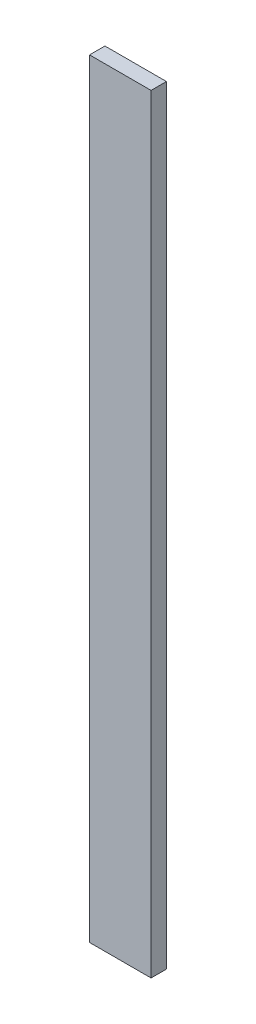
ISO-10303-21;
HEADER;
FILE_DESCRIPTION(('STEP AP214'),'2;1');
FILE_NAME('part.step','',(''),(''),'','','');
FILE_SCHEMA(('AUTOMOTIVE_DESIGN { 1 0 10303 214 1 1 1 1 }'));
ENDSEC;
DATA;
#1=APPLICATION_CONTEXT('core data for automotive mechanical design processes');
#2=APPLICATION_PROTOCOL_DEFINITION('international standard','automotive_design',2000,#1);
#3=PRODUCT_CONTEXT('',#1,'mechanical');
#4=PRODUCT('Part','Part','',(#3));
#5=PRODUCT_RELATED_PRODUCT_CATEGORY('part','',(#4));
#6=PRODUCT_DEFINITION_FORMATION('','',#4);
#7=PRODUCT_DEFINITION_CONTEXT('part definition',#1,'design');
#8=PRODUCT_DEFINITION('design','',#6,#7);
#9=PRODUCT_DEFINITION_SHAPE('','',#8);
#10=(LENGTH_UNIT() NAMED_UNIT(*) SI_UNIT(.MILLI.,.METRE.));
#11=(NAMED_UNIT(*) PLANE_ANGLE_UNIT() SI_UNIT($,.RADIAN.));
#12=(NAMED_UNIT(*) SI_UNIT($,.STERADIAN.) SOLID_ANGLE_UNIT());
#13=UNCERTAINTY_MEASURE_WITH_UNIT(LENGTH_MEASURE(1.E-05),#10,'distance_accuracy_value','');
#14=(GEOMETRIC_REPRESENTATION_CONTEXT(3) GLOBAL_UNCERTAINTY_ASSIGNED_CONTEXT((#13)) GLOBAL_UNIT_ASSIGNED_CONTEXT((#10,
#11,#12)) REPRESENTATION_CONTEXT('',''));
#15=CARTESIAN_POINT('',(0.,0.,0.));
#16=DIRECTION('',(0.,0.,1.));
#17=DIRECTION('',(1.,0.,0.));
#18=AXIS2_PLACEMENT_3D('',#15,#16,#17);
#19=CARTESIAN_POINT('',(12.7,158.75,6.35));
#20=DIRECTION('',(-1.,0.,0.));
#21=DIRECTION('',(0.,-1.,0.));
#22=AXIS2_PLACEMENT_3D('',#19,#20,#21);
#23=PLANE('',#22);
#24=DIRECTION('',(0.,1.,0.));
#25=VECTOR('',#24,1.);
#26=CARTESIAN_POINT('',(12.7,158.75,0.));
#27=LINE('',#26,#25);
#28=CARTESIAN_POINT('',(12.7,-158.75,0.));
#29=VERTEX_POINT('',#28);
#30=CARTESIAN_POINT('',(12.7,158.75,0.));
#31=VERTEX_POINT('',#30);
#32=EDGE_CURVE('E96',#29,#31,#27,.T.);
#33=ORIENTED_EDGE('',*,*,#32,.T.);
#34=DIRECTION('',(0.,0.,-1.));
#35=VECTOR('',#34,1.);
#36=CARTESIAN_POINT('',(12.7,158.75,6.35));
#37=LINE('',#36,#35);
#38=CARTESIAN_POINT('',(12.7,158.75,6.35));
#39=VERTEX_POINT('',#38);
#40=EDGE_CURVE('E11',#39,#31,#37,.T.);
#41=ORIENTED_EDGE('',*,*,#40,.F.);
#42=DIRECTION('',(0.,1.,0.));
#43=VECTOR('',#42,1.);
#44=CARTESIAN_POINT('',(12.7,158.75,6.35));
#45=LINE('',#44,#43);
#46=CARTESIAN_POINT('',(12.7,-158.75,6.35));
#47=VERTEX_POINT('',#46);
#48=EDGE_CURVE('E84',#47,#39,#45,.T.);
#49=ORIENTED_EDGE('',*,*,#48,.F.);
#50=DIRECTION('',(0.,0.,-1.));
#51=VECTOR('',#50,1.);
#52=CARTESIAN_POINT('',(12.7,-158.75,6.35));
#53=LINE('',#52,#51);
#54=EDGE_CURVE('E92',#47,#29,#53,.T.);
#55=ORIENTED_EDGE('',*,*,#54,.T.);
#56=EDGE_LOOP('',(#33,#41,#49,#55));
#57=FACE_BOUND('',#56,.T.);
#58=ADVANCED_FACE('F33',(#57),#23,.F.);
#59=CARTESIAN_POINT('',(-12.7,158.75,6.35));
#60=DIRECTION('',(0.,-1.,0.));
#61=DIRECTION('',(0.,0.,-1.));
#62=AXIS2_PLACEMENT_3D('',#59,#60,#61);
#63=PLANE('',#62);
#64=DIRECTION('',(-1.,0.,0.));
#65=VECTOR('',#64,1.);
#66=CARTESIAN_POINT('',(-12.7,158.75,0.));
#67=LINE('',#66,#65);
#68=CARTESIAN_POINT('',(-12.7,158.75,0.));
#69=VERTEX_POINT('',#68);
#70=EDGE_CURVE('E88',#31,#69,#67,.T.);
#71=ORIENTED_EDGE('',*,*,#70,.T.);
#72=DIRECTION('',(0.,0.,-1.));
#73=VECTOR('',#72,1.);
#74=CARTESIAN_POINT('',(-12.7,158.75,6.35));
#75=LINE('',#74,#73);
#76=CARTESIAN_POINT('',(-12.7,158.75,6.35));
#77=VERTEX_POINT('',#76);
#78=EDGE_CURVE('E41',#77,#69,#75,.T.);
#79=ORIENTED_EDGE('',*,*,#78,.F.);
#80=DIRECTION('',(-1.,0.,0.));
#81=VECTOR('',#80,1.);
#82=CARTESIAN_POINT('',(-12.7,158.75,6.35));
#83=LINE('',#82,#81);
#84=EDGE_CURVE('E79',#39,#77,#83,.T.);
#85=ORIENTED_EDGE('',*,*,#84,.F.);
#86=ORIENTED_EDGE('',*,*,#40,.T.);
#87=EDGE_LOOP('',(#71,#79,#85,#86));
#88=FACE_BOUND('',#87,.T.);
#89=ADVANCED_FACE('F87',(#88),#63,.F.);
#90=CARTESIAN_POINT('',(-12.7,158.75,6.35));
#91=DIRECTION('',(1.,0.,0.));
#92=DIRECTION('',(0.,1.,0.));
#93=AXIS2_PLACEMENT_3D('',#90,#91,#92);
#94=PLANE('',#93);
#95=DIRECTION('',(0.,-1.,0.));
#96=VECTOR('',#95,1.);
#97=CARTESIAN_POINT('',(-12.7,158.75,0.));
#98=LINE('',#97,#96);
#99=CARTESIAN_POINT('',(-12.7,-158.75,0.));
#100=VERTEX_POINT('',#99);
#101=EDGE_CURVE('E66',#69,#100,#98,.T.);
#102=ORIENTED_EDGE('',*,*,#101,.T.);
#103=DIRECTION('',(0.,0.,-1.));
#104=VECTOR('',#103,1.);
#105=CARTESIAN_POINT('',(-12.7,-158.75,6.35));
#106=LINE('',#105,#104);
#107=CARTESIAN_POINT('',(-12.7,-158.75,6.35));
#108=VERTEX_POINT('',#107);
#109=EDGE_CURVE('E89',#108,#100,#106,.T.);
#110=ORIENTED_EDGE('',*,*,#109,.F.);
#111=DIRECTION('',(0.,-1.,0.));
#112=VECTOR('',#111,1.);
#113=CARTESIAN_POINT('',(-12.7,158.75,6.35));
#114=LINE('',#113,#112);
#115=EDGE_CURVE('E82',#77,#108,#114,.T.);
#116=ORIENTED_EDGE('',*,*,#115,.F.);
#117=ORIENTED_EDGE('',*,*,#78,.T.);
#118=EDGE_LOOP('',(#102,#110,#116,#117));
#119=FACE_BOUND('',#118,.T.);
#120=ADVANCED_FACE('F90',(#119),#94,.F.);
#121=CARTESIAN_POINT('',(-12.7,-158.75,6.35));
#122=DIRECTION('',(0.,1.,0.));
#123=DIRECTION('',(0.,0.,1.));
#124=AXIS2_PLACEMENT_3D('',#121,#122,#123);
#125=PLANE('',#124);
#126=DIRECTION('',(1.,0.,0.));
#127=VECTOR('',#126,1.);
#128=CARTESIAN_POINT('',(-12.7,-158.75,0.));
#129=LINE('',#128,#127);
#130=EDGE_CURVE('E72',#100,#29,#129,.T.);
#131=ORIENTED_EDGE('',*,*,#130,.T.);
#132=ORIENTED_EDGE('',*,*,#54,.F.);
#133=DIRECTION('',(1.,0.,0.));
#134=VECTOR('',#133,1.);
#135=CARTESIAN_POINT('',(-12.7,-158.75,6.35));
#136=LINE('',#135,#134);
#137=EDGE_CURVE('E49',#108,#47,#136,.T.);
#138=ORIENTED_EDGE('',*,*,#137,.F.);
#139=ORIENTED_EDGE('',*,*,#109,.T.);
#140=EDGE_LOOP('',(#131,#132,#138,#139));
#141=FACE_BOUND('',#140,.T.);
#142=ADVANCED_FACE('F103',(#141),#125,.F.);
#143=CARTESIAN_POINT('',(0.,0.,6.35));
#144=DIRECTION('',(0.,0.,1.));
#145=DIRECTION('',(1.,0.,0.));
#146=AXIS2_PLACEMENT_3D('',#143,#144,#145);
#147=PLANE('',#146);
#148=ORIENTED_EDGE('',*,*,#48,.T.);
#149=ORIENTED_EDGE('',*,*,#84,.T.);
#150=ORIENTED_EDGE('',*,*,#115,.T.);
#151=ORIENTED_EDGE('',*,*,#137,.T.);
#152=EDGE_LOOP('',(#148,#149,#150,#151));
#153=FACE_BOUND('',#152,.T.);
#154=ADVANCED_FACE('F80',(#153),#147,.T.);
#155=CARTESIAN_POINT('',(0.,0.,0.));
#156=DIRECTION('',(0.,0.,1.));
#157=DIRECTION('',(1.,0.,0.));
#158=AXIS2_PLACEMENT_3D('',#155,#156,#157);
#159=PLANE('',#158);
#160=ORIENTED_EDGE('',*,*,#32,.F.);
#161=ORIENTED_EDGE('',*,*,#130,.F.);
#162=ORIENTED_EDGE('',*,*,#101,.F.);
#163=ORIENTED_EDGE('',*,*,#70,.F.);
#164=EDGE_LOOP('',(#160,#161,#162,#163));
#165=FACE_BOUND('',#164,.T.);
#166=ADVANCED_FACE('F106',(#165),#159,.F.);
#167=CLOSED_SHELL('',(#58,#89,#120,#142,#154,#166));
#168=MANIFOLD_SOLID_BREP('B2',#167);
#169=ADVANCED_BREP_SHAPE_REPRESENTATION('',(#18,#168),#14);
#170=SHAPE_DEFINITION_REPRESENTATION(#9,#169);
ENDSEC;
END-ISO-10303-21;
